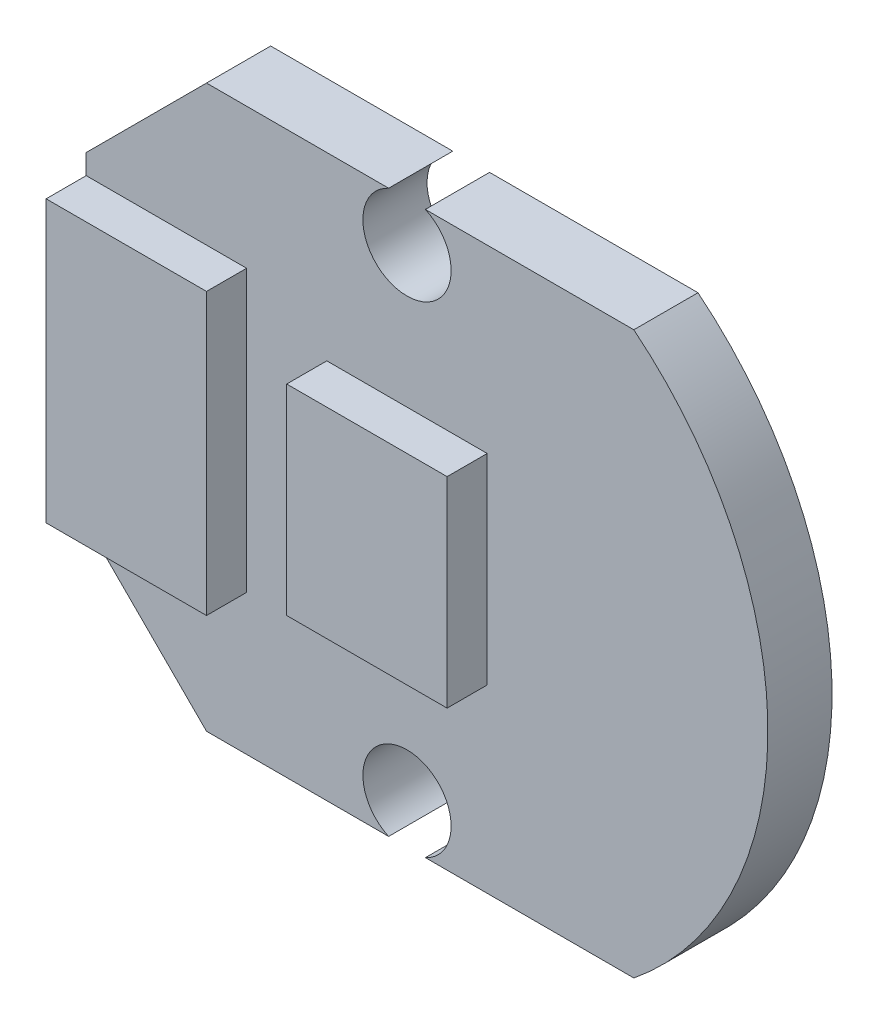
ISO-10303-21;
HEADER;
FILE_DESCRIPTION(('STEP AP214'),'2;1');
FILE_NAME('part.step','',(''),(''),'','','');
FILE_SCHEMA(('AUTOMOTIVE_DESIGN { 1 0 10303 214 1 1 1 1 }'));
ENDSEC;
DATA;
#1=APPLICATION_CONTEXT('core data for automotive mechanical design processes');
#2=APPLICATION_PROTOCOL_DEFINITION('international standard','automotive_design',2000,#1);
#3=PRODUCT_CONTEXT('',#1,'mechanical');
#4=PRODUCT('Part','Part','',(#3));
#5=PRODUCT_RELATED_PRODUCT_CATEGORY('part','',(#4));
#6=PRODUCT_DEFINITION_FORMATION('','',#4);
#7=PRODUCT_DEFINITION_CONTEXT('part definition',#1,'design');
#8=PRODUCT_DEFINITION('design','',#6,#7);
#9=PRODUCT_DEFINITION_SHAPE('','',#8);
#10=(LENGTH_UNIT() NAMED_UNIT(*) SI_UNIT(.MILLI.,.METRE.));
#11=(NAMED_UNIT(*) PLANE_ANGLE_UNIT() SI_UNIT($,.RADIAN.));
#12=(NAMED_UNIT(*) SI_UNIT($,.STERADIAN.) SOLID_ANGLE_UNIT());
#13=UNCERTAINTY_MEASURE_WITH_UNIT(LENGTH_MEASURE(1.E-05),#10,'distance_accuracy_value','');
#14=(GEOMETRIC_REPRESENTATION_CONTEXT(3) GLOBAL_UNCERTAINTY_ASSIGNED_CONTEXT((#13)) GLOBAL_UNIT_ASSIGNED_CONTEXT((#10,
#11,#12)) REPRESENTATION_CONTEXT('',''));
#15=CARTESIAN_POINT('',(0.,0.,0.));
#16=DIRECTION('',(0.,0.,1.));
#17=DIRECTION('',(1.,0.,0.));
#18=AXIS2_PLACEMENT_3D('',#15,#16,#17);
#19=CARTESIAN_POINT('',(0.,0.,1.6));
#20=DIRECTION('',(0.,0.,-1.));
#21=DIRECTION('',(-1.,0.,0.));
#22=AXIS2_PLACEMENT_3D('',#19,#20,#21);
#23=PLANE('',#22);
#24=DIRECTION('',(0.,1.,0.));
#25=VECTOR('',#24,1.);
#26=CARTESIAN_POINT('',(2.,2.5,1.6));
#27=LINE('',#26,#25);
#28=CARTESIAN_POINT('',(2.,-2.5,1.6));
#29=VERTEX_POINT('',#28);
#30=CARTESIAN_POINT('',(2.,2.5,1.6));
#31=VERTEX_POINT('',#30);
#32=EDGE_CURVE('E180',#29,#31,#27,.T.);
#33=ORIENTED_EDGE('',*,*,#32,.F.);
#34=DIRECTION('',(1.,0.,0.));
#35=VECTOR('',#34,1.);
#36=CARTESIAN_POINT('',(-2.,-2.5,1.6));
#37=LINE('',#36,#35);
#38=CARTESIAN_POINT('',(-2.,-2.5,1.6));
#39=VERTEX_POINT('',#38);
#40=EDGE_CURVE('E193',#39,#29,#37,.T.);
#41=ORIENTED_EDGE('',*,*,#40,.F.);
#42=DIRECTION('',(0.,-1.,0.));
#43=VECTOR('',#42,1.);
#44=CARTESIAN_POINT('',(-2.,2.5,1.6));
#45=LINE('',#44,#43);
#46=CARTESIAN_POINT('',(-2.,2.5,1.6));
#47=VERTEX_POINT('',#46);
#48=EDGE_CURVE('E202',#47,#39,#45,.T.);
#49=ORIENTED_EDGE('',*,*,#48,.F.);
#50=DIRECTION('',(-1.,0.,0.));
#51=VECTOR('',#50,1.);
#52=CARTESIAN_POINT('',(-2.,2.5,1.6));
#53=LINE('',#52,#51);
#54=EDGE_CURVE('E183',#31,#47,#53,.T.);
#55=ORIENTED_EDGE('',*,*,#54,.F.);
#56=EDGE_LOOP('',(#33,#41,#49,#55));
#57=FACE_BOUND('',#56,.T.);
#58=DIRECTION('',(1.,0.,0.));
#59=VECTOR('',#58,1.);
#60=CARTESIAN_POINT('',(-4.,-3.5,1.6));
#61=LINE('',#60,#59);
#62=CARTESIAN_POINT('',(-8.,-3.5,1.6));
#63=VERTEX_POINT('',#62);
#64=CARTESIAN_POINT('',(-4.,-3.5,1.6));
#65=VERTEX_POINT('',#64);
#66=EDGE_CURVE('E335',#63,#65,#61,.T.);
#67=ORIENTED_EDGE('',*,*,#66,.F.);
#68=DIRECTION('',(0.,-1.,0.));
#69=VECTOR('',#68,1.);
#70=CARTESIAN_POINT('',(-8.,3.99999999999999,1.6));
#71=LINE('',#70,#69);
#72=CARTESIAN_POINT('',(-8.,-3.99999999999999,1.6));
#73=VERTEX_POINT('',#72);
#74=EDGE_CURVE('E179',#63,#73,#71,.T.);
#75=ORIENTED_EDGE('',*,*,#74,.T.);
#76=DIRECTION('',(0.707106781186546,-0.707106781186549,0.));
#77=VECTOR('',#76,1.);
#78=CARTESIAN_POINT('',(-8.,-3.99999999999999,1.6));
#79=LINE('',#78,#77);
#80=CARTESIAN_POINT('',(-5.,-7.,1.6));
#81=VERTEX_POINT('',#80);
#82=EDGE_CURVE('E247',#73,#81,#79,.T.);
#83=ORIENTED_EDGE('',*,*,#82,.T.);
#84=DIRECTION('',(1.,0.,0.));
#85=VECTOR('',#84,1.);
#86=CARTESIAN_POINT('',(-5.,-7.,1.6));
#87=LINE('',#86,#85);
#88=CARTESIAN_POINT('',(-0.458257569496079,-7.,1.6));
#89=VERTEX_POINT('',#88);
#90=EDGE_CURVE('E250',#81,#89,#87,.T.);
#91=ORIENTED_EDGE('',*,*,#90,.T.);
#92=CARTESIAN_POINT('',(0.,-6.00000000000023,1.6));
#93=DIRECTION('',(0.,0.,1.));
#94=DIRECTION('',(-1.,0.,0.));
#95=AXIS2_PLACEMENT_3D('',#92,#93,#94);
#96=CIRCLE('',#95,1.1);
#97=CARTESIAN_POINT('',(0.458257569496079,-7.,1.6));
#98=VERTEX_POINT('',#97);
#99=EDGE_CURVE('E218',#98,#89,#96,.T.);
#100=ORIENTED_EDGE('',*,*,#99,.F.);
#101=CARTESIAN_POINT('',(5.65685424949238,-7.,1.6));
#102=VERTEX_POINT('',#101);
#103=EDGE_CURVE('E249',#98,#102,#87,.T.);
#104=ORIENTED_EDGE('',*,*,#103,.T.);
#105=CARTESIAN_POINT('',(0.,0.,1.6));
#106=DIRECTION('',(0.,0.,1.));
#107=DIRECTION('',(-1.,0.,0.));
#108=AXIS2_PLACEMENT_3D('',#105,#106,#107);
#109=CIRCLE('',#108,9.);
#110=CARTESIAN_POINT('',(5.65685424949238,7.,1.6));
#111=VERTEX_POINT('',#110);
#112=EDGE_CURVE('E235',#102,#111,#109,.T.);
#113=ORIENTED_EDGE('',*,*,#112,.T.);
#114=DIRECTION('',(-1.,0.,0.));
#115=VECTOR('',#114,1.);
#116=CARTESIAN_POINT('',(5.65685424949238,7.,1.6));
#117=LINE('',#116,#115);
#118=CARTESIAN_POINT('',(0.458257569496079,7.,1.6));
#119=VERTEX_POINT('',#118);
#120=EDGE_CURVE('E240',#111,#119,#117,.T.);
#121=ORIENTED_EDGE('',*,*,#120,.T.);
#122=CARTESIAN_POINT('',(0.,6.00000000000023,1.6));
#123=DIRECTION('',(0.,0.,1.));
#124=DIRECTION('',(1.,0.,0.));
#125=AXIS2_PLACEMENT_3D('',#122,#123,#124);
#126=CIRCLE('',#125,1.1);
#127=CARTESIAN_POINT('',(-0.458257569496079,7.,1.6));
#128=VERTEX_POINT('',#127);
#129=EDGE_CURVE('E219',#128,#119,#126,.T.);
#130=ORIENTED_EDGE('',*,*,#129,.F.);
#131=CARTESIAN_POINT('',(-5.,7.,1.6));
#132=VERTEX_POINT('',#131);
#133=EDGE_CURVE('E238',#128,#132,#117,.T.);
#134=ORIENTED_EDGE('',*,*,#133,.T.);
#135=DIRECTION('',(-0.707106781186546,-0.707106781186549,0.));
#136=VECTOR('',#135,1.);
#137=CARTESIAN_POINT('',(-5.,7.,1.6));
#138=LINE('',#137,#136);
#139=CARTESIAN_POINT('',(-8.,3.99999999999999,1.6));
#140=VERTEX_POINT('',#139);
#141=EDGE_CURVE('E243',#132,#140,#138,.T.);
#142=ORIENTED_EDGE('',*,*,#141,.T.);
#143=CARTESIAN_POINT('',(-8.,3.5,1.6));
#144=VERTEX_POINT('',#143);
#145=EDGE_CURVE('E245',#140,#144,#71,.T.);
#146=ORIENTED_EDGE('',*,*,#145,.T.);
#147=DIRECTION('',(-1.,0.,0.));
#148=VECTOR('',#147,1.);
#149=CARTESIAN_POINT('',(-4.,3.5,1.6));
#150=LINE('',#149,#148);
#151=CARTESIAN_POINT('',(-4.,3.5,1.6));
#152=VERTEX_POINT('',#151);
#153=EDGE_CURVE('E54',#152,#144,#150,.T.);
#154=ORIENTED_EDGE('',*,*,#153,.F.);
#155=DIRECTION('',(0.,1.,0.));
#156=VECTOR('',#155,1.);
#157=CARTESIAN_POINT('',(-4.,-3.5,1.6));
#158=LINE('',#157,#156);
#159=EDGE_CURVE('E49',#65,#152,#158,.T.);
#160=ORIENTED_EDGE('',*,*,#159,.F.);
#161=EDGE_LOOP('',(#67,#75,#83,#91,#100,#104,#113,#121,#130,#134,#142,#146,#154,#160));
#162=FACE_BOUND('',#161,.T.);
#163=ADVANCED_FACE('F34',(#57,#162),#23,.F.);
#164=CARTESIAN_POINT('',(5.65685424949238,7.,1.6));
#165=DIRECTION('',(0.,-1.,0.));
#166=DIRECTION('',(1.,0.,0.));
#167=AXIS2_PLACEMENT_3D('',#164,#165,#166);
#168=PLANE('',#167);
#169=DIRECTION('',(-1.,0.,0.));
#170=VECTOR('',#169,1.);
#171=CARTESIAN_POINT('',(5.65685424949238,7.,0.));
#172=LINE('',#171,#170);
#173=CARTESIAN_POINT('',(5.65685424949238,7.,0.));
#174=VERTEX_POINT('',#173);
#175=CARTESIAN_POINT('',(0.458257569496079,7.,0.));
#176=VERTEX_POINT('',#175);
#177=EDGE_CURVE('E257',#174,#176,#172,.T.);
#178=ORIENTED_EDGE('',*,*,#177,.T.);
#179=DIRECTION('',(0.,0.,1.));
#180=VECTOR('',#179,1.);
#181=CARTESIAN_POINT('',(0.458257569496079,7.,0.));
#182=LINE('',#181,#180);
#183=EDGE_CURVE('E231',#176,#119,#182,.T.);
#184=ORIENTED_EDGE('',*,*,#183,.T.);
#185=ORIENTED_EDGE('',*,*,#120,.F.);
#186=DIRECTION('',(0.,0.,-1.));
#187=VECTOR('',#186,1.);
#188=CARTESIAN_POINT('',(5.65685424949238,7.,1.6));
#189=LINE('',#188,#187);
#190=EDGE_CURVE('E283',#111,#174,#189,.T.);
#191=ORIENTED_EDGE('',*,*,#190,.T.);
#192=EDGE_LOOP('',(#178,#184,#185,#191));
#193=FACE_BOUND('',#192,.T.);
#194=ADVANCED_FACE('F349',(#193),#168,.F.);
#195=CARTESIAN_POINT('',(-5.,-7.,1.6));
#196=DIRECTION('',(0.,1.,0.));
#197=DIRECTION('',(0.,0.,1.));
#198=AXIS2_PLACEMENT_3D('',#195,#196,#197);
#199=PLANE('',#198);
#200=DIRECTION('',(1.,0.,0.));
#201=VECTOR('',#200,1.);
#202=CARTESIAN_POINT('',(-5.,-7.,0.));
#203=LINE('',#202,#201);
#204=CARTESIAN_POINT('',(-5.,-7.,0.));
#205=VERTEX_POINT('',#204);
#206=CARTESIAN_POINT('',(-0.458257569496079,-7.,0.));
#207=VERTEX_POINT('',#206);
#208=EDGE_CURVE('E239',#205,#207,#203,.T.);
#209=ORIENTED_EDGE('',*,*,#208,.T.);
#210=DIRECTION('',(0.,0.,1.));
#211=VECTOR('',#210,1.);
#212=CARTESIAN_POINT('',(-0.458257569496079,-7.,0.));
#213=LINE('',#212,#211);
#214=EDGE_CURVE('E225',#207,#89,#213,.T.);
#215=ORIENTED_EDGE('',*,*,#214,.T.);
#216=ORIENTED_EDGE('',*,*,#90,.F.);
#217=DIRECTION('',(0.,0.,-1.));
#218=VECTOR('',#217,1.);
#219=CARTESIAN_POINT('',(-5.,-7.,1.6));
#220=LINE('',#219,#218);
#221=EDGE_CURVE('E271',#81,#205,#220,.T.);
#222=ORIENTED_EDGE('',*,*,#221,.T.);
#223=EDGE_LOOP('',(#209,#215,#216,#222));
#224=FACE_BOUND('',#223,.T.);
#225=ADVANCED_FACE('F305',(#224),#199,.F.);
#226=CARTESIAN_POINT('',(0.,0.,1.6));
#227=DIRECTION('',(0.,0.,-1.));
#228=DIRECTION('',(-1.,0.,0.));
#229=AXIS2_PLACEMENT_3D('',#226,#227,#228);
#230=CYLINDRICAL_SURFACE('',#229,9.);
#231=CARTESIAN_POINT('',(0.,0.,0.));
#232=DIRECTION('',(0.,0.,1.));
#233=DIRECTION('',(-1.,0.,0.));
#234=AXIS2_PLACEMENT_3D('',#231,#232,#233);
#235=CIRCLE('',#234,9.);
#236=CARTESIAN_POINT('',(5.65685424949238,-7.,0.));
#237=VERTEX_POINT('',#236);
#238=EDGE_CURVE('E234',#237,#174,#235,.T.);
#239=ORIENTED_EDGE('',*,*,#238,.T.);
#240=ORIENTED_EDGE('',*,*,#190,.F.);
#241=ORIENTED_EDGE('',*,*,#112,.F.);
#242=DIRECTION('',(0.,0.,-1.));
#243=VECTOR('',#242,1.);
#244=CARTESIAN_POINT('',(5.65685424949238,-7.,1.6));
#245=LINE('',#244,#243);
#246=EDGE_CURVE('E253',#102,#237,#245,.T.);
#247=ORIENTED_EDGE('',*,*,#246,.T.);
#248=EDGE_LOOP('',(#239,#240,#241,#247));
#249=FACE_BOUND('',#248,.T.);
#250=ADVANCED_FACE('F36',(#249),#230,.T.);
#251=ORIENTED_EDGE('',*,*,#133,.F.);
#252=DIRECTION('',(0.,0.,1.));
#253=VECTOR('',#252,1.);
#254=CARTESIAN_POINT('',(-0.458257569496079,7.,0.));
#255=LINE('',#254,#253);
#256=CARTESIAN_POINT('',(-0.458257569496079,7.,0.));
#257=VERTEX_POINT('',#256);
#258=EDGE_CURVE('E228',#128,#257,#255,.F.);
#259=ORIENTED_EDGE('',*,*,#258,.T.);
#260=CARTESIAN_POINT('',(-5.,7.,0.));
#261=VERTEX_POINT('',#260);
#262=EDGE_CURVE('E256',#257,#261,#172,.T.);
#263=ORIENTED_EDGE('',*,*,#262,.T.);
#264=DIRECTION('',(0.,0.,-1.));
#265=VECTOR('',#264,1.);
#266=CARTESIAN_POINT('',(-5.,7.,1.6));
#267=LINE('',#266,#265);
#268=EDGE_CURVE('E280',#132,#261,#267,.T.);
#269=ORIENTED_EDGE('',*,*,#268,.F.);
#270=EDGE_LOOP('',(#251,#259,#263,#269));
#271=FACE_BOUND('',#270,.T.);
#272=ADVANCED_FACE('F322',(#271),#168,.F.);
#273=CARTESIAN_POINT('',(-5.,7.,1.6));
#274=DIRECTION('',(0.707106781186549,-0.707106781186546,0.));
#275=DIRECTION('',(0.707106781186546,0.707106781186549,0.));
#276=AXIS2_PLACEMENT_3D('',#273,#274,#275);
#277=PLANE('',#276);
#278=DIRECTION('',(-0.707106781186546,-0.707106781186549,0.));
#279=VECTOR('',#278,1.);
#280=CARTESIAN_POINT('',(-5.,7.,0.));
#281=LINE('',#280,#279);
#282=CARTESIAN_POINT('',(-8.,3.99999999999999,0.));
#283=VERTEX_POINT('',#282);
#284=EDGE_CURVE('E260',#261,#283,#281,.T.);
#285=ORIENTED_EDGE('',*,*,#284,.T.);
#286=DIRECTION('',(0.,0.,-1.));
#287=VECTOR('',#286,1.);
#288=CARTESIAN_POINT('',(-8.,3.99999999999999,1.6));
#289=LINE('',#288,#287);
#290=EDGE_CURVE('E277',#140,#283,#289,.T.);
#291=ORIENTED_EDGE('',*,*,#290,.F.);
#292=ORIENTED_EDGE('',*,*,#141,.F.);
#293=ORIENTED_EDGE('',*,*,#268,.T.);
#294=EDGE_LOOP('',(#285,#291,#292,#293));
#295=FACE_BOUND('',#294,.T.);
#296=ADVANCED_FACE('F317',(#295),#277,.F.);
#297=CARTESIAN_POINT('',(-8.,3.99999999999999,1.6));
#298=DIRECTION('',(1.,0.,0.));
#299=DIRECTION('',(0.,0.,-1.));
#300=AXIS2_PLACEMENT_3D('',#297,#298,#299);
#301=PLANE('',#300);
#302=DIRECTION('',(0.,-1.,0.));
#303=VECTOR('',#302,1.);
#304=CARTESIAN_POINT('',(-8.,3.99999999999999,0.));
#305=LINE('',#304,#303);
#306=CARTESIAN_POINT('',(-8.,-3.99999999999999,0.));
#307=VERTEX_POINT('',#306);
#308=EDGE_CURVE('E262',#283,#307,#305,.T.);
#309=ORIENTED_EDGE('',*,*,#308,.T.);
#310=DIRECTION('',(0.,0.,-1.));
#311=VECTOR('',#310,1.);
#312=CARTESIAN_POINT('',(-8.,-3.99999999999999,1.6));
#313=LINE('',#312,#311);
#314=EDGE_CURVE('E274',#73,#307,#313,.T.);
#315=ORIENTED_EDGE('',*,*,#314,.F.);
#316=ORIENTED_EDGE('',*,*,#74,.F.);
#317=DIRECTION('',(0.,0.,-1.));
#318=VECTOR('',#317,1.);
#319=CARTESIAN_POINT('',(-8.,-3.5,2.6));
#320=LINE('',#319,#318);
#321=CARTESIAN_POINT('',(-8.,-3.5,2.6));
#322=VERTEX_POINT('',#321);
#323=EDGE_CURVE('E161',#322,#63,#320,.T.);
#324=ORIENTED_EDGE('',*,*,#323,.F.);
#325=DIRECTION('',(0.,-1.,0.));
#326=VECTOR('',#325,1.);
#327=CARTESIAN_POINT('',(-8.,-3.5,2.6));
#328=LINE('',#327,#326);
#329=CARTESIAN_POINT('',(-8.,3.5,2.6));
#330=VERTEX_POINT('',#329);
#331=EDGE_CURVE('E167',#330,#322,#328,.T.);
#332=ORIENTED_EDGE('',*,*,#331,.F.);
#333=DIRECTION('',(0.,0.,-1.));
#334=VECTOR('',#333,1.);
#335=CARTESIAN_POINT('',(-8.,3.5,2.6));
#336=LINE('',#335,#334);
#337=EDGE_CURVE('E328',#330,#144,#336,.T.);
#338=ORIENTED_EDGE('',*,*,#337,.T.);
#339=ORIENTED_EDGE('',*,*,#145,.F.);
#340=ORIENTED_EDGE('',*,*,#290,.T.);
#341=EDGE_LOOP('',(#309,#315,#316,#324,#332,#338,#339,#340));
#342=FACE_BOUND('',#341,.T.);
#343=ADVANCED_FACE('F177',(#342),#301,.F.);
#344=CARTESIAN_POINT('',(-8.,-3.99999999999999,1.6));
#345=DIRECTION('',(0.707106781186549,0.707106781186546,0.));
#346=DIRECTION('',(-0.707106781186546,0.707106781186549,0.));
#347=AXIS2_PLACEMENT_3D('',#344,#345,#346);
#348=PLANE('',#347);
#349=DIRECTION('',(0.707106781186546,-0.707106781186549,0.));
#350=VECTOR('',#349,1.);
#351=CARTESIAN_POINT('',(-8.,-3.99999999999999,0.));
#352=LINE('',#351,#350);
#353=EDGE_CURVE('E264',#307,#205,#352,.T.);
#354=ORIENTED_EDGE('',*,*,#353,.T.);
#355=ORIENTED_EDGE('',*,*,#221,.F.);
#356=ORIENTED_EDGE('',*,*,#82,.F.);
#357=ORIENTED_EDGE('',*,*,#314,.T.);
#358=EDGE_LOOP('',(#354,#355,#356,#357));
#359=FACE_BOUND('',#358,.T.);
#360=ADVANCED_FACE('F311',(#359),#348,.F.);
#361=ORIENTED_EDGE('',*,*,#103,.F.);
#362=DIRECTION('',(0.,0.,1.));
#363=VECTOR('',#362,1.);
#364=CARTESIAN_POINT('',(0.458257569496079,-7.,0.));
#365=LINE('',#364,#363);
#366=CARTESIAN_POINT('',(0.458257569496079,-7.,0.));
#367=VERTEX_POINT('',#366);
#368=EDGE_CURVE('E221',#98,#367,#365,.F.);
#369=ORIENTED_EDGE('',*,*,#368,.T.);
#370=EDGE_CURVE('E266',#367,#237,#203,.T.);
#371=ORIENTED_EDGE('',*,*,#370,.T.);
#372=ORIENTED_EDGE('',*,*,#246,.F.);
#373=EDGE_LOOP('',(#361,#369,#371,#372));
#374=FACE_BOUND('',#373,.T.);
#375=ADVANCED_FACE('F294',(#374),#199,.F.);
#376=CARTESIAN_POINT('',(0.,0.,0.));
#377=DIRECTION('',(0.,0.,-1.));
#378=DIRECTION('',(-1.,0.,0.));
#379=AXIS2_PLACEMENT_3D('',#376,#377,#378);
#380=PLANE('',#379);
#381=CARTESIAN_POINT('',(0.,6.00000000000023,0.));
#382=DIRECTION('',(0.,0.,-1.));
#383=DIRECTION('',(-1.,0.,0.));
#384=AXIS2_PLACEMENT_3D('',#381,#382,#383);
#385=CIRCLE('',#384,1.1);
#386=EDGE_CURVE('E11',#176,#257,#385,.T.);
#387=ORIENTED_EDGE('',*,*,#386,.F.);
#388=ORIENTED_EDGE('',*,*,#177,.F.);
#389=ORIENTED_EDGE('',*,*,#238,.F.);
#390=ORIENTED_EDGE('',*,*,#370,.F.);
#391=CARTESIAN_POINT('',(0.,-6.00000000000023,0.));
#392=DIRECTION('',(0.,0.,-1.));
#393=DIRECTION('',(-1.,0.,0.));
#394=AXIS2_PLACEMENT_3D('',#391,#392,#393);
#395=CIRCLE('',#394,1.1);
#396=EDGE_CURVE('E42',#207,#367,#395,.T.);
#397=ORIENTED_EDGE('',*,*,#396,.F.);
#398=ORIENTED_EDGE('',*,*,#208,.F.);
#399=ORIENTED_EDGE('',*,*,#353,.F.);
#400=ORIENTED_EDGE('',*,*,#308,.F.);
#401=ORIENTED_EDGE('',*,*,#284,.F.);
#402=ORIENTED_EDGE('',*,*,#262,.F.);
#403=EDGE_LOOP('',(#387,#388,#389,#390,#397,#398,#399,#400,#401,#402));
#404=FACE_BOUND('',#403,.T.);
#405=ADVANCED_FACE('F298',(#404),#380,.T.);
#406=CARTESIAN_POINT('',(0.,-6.00000000000023,0.));
#407=DIRECTION('',(0.,0.,1.));
#408=DIRECTION('',(1.,0.,0.));
#409=AXIS2_PLACEMENT_3D('',#406,#407,#408);
#410=CYLINDRICAL_SURFACE('',#409,1.1);
#411=ORIENTED_EDGE('',*,*,#396,.T.);
#412=ORIENTED_EDGE('',*,*,#368,.F.);
#413=ORIENTED_EDGE('',*,*,#99,.T.);
#414=ORIENTED_EDGE('',*,*,#214,.F.);
#415=EDGE_LOOP('',(#411,#412,#413,#414));
#416=FACE_BOUND('',#415,.T.);
#417=ADVANCED_FACE('F287',(#416),#410,.F.);
#418=CARTESIAN_POINT('',(0.,6.00000000000023,0.));
#419=DIRECTION('',(0.,0.,1.));
#420=DIRECTION('',(1.,0.,0.));
#421=AXIS2_PLACEMENT_3D('',#418,#419,#420);
#422=CYLINDRICAL_SURFACE('',#421,1.1);
#423=ORIENTED_EDGE('',*,*,#386,.T.);
#424=ORIENTED_EDGE('',*,*,#258,.F.);
#425=ORIENTED_EDGE('',*,*,#129,.T.);
#426=ORIENTED_EDGE('',*,*,#183,.F.);
#427=EDGE_LOOP('',(#423,#424,#425,#426));
#428=FACE_BOUND('',#427,.T.);
#429=ADVANCED_FACE('F324',(#428),#422,.F.);
#430=CARTESIAN_POINT('',(2.,2.5,2.6));
#431=DIRECTION('',(-1.,0.,0.));
#432=DIRECTION('',(0.,-1.,0.));
#433=AXIS2_PLACEMENT_3D('',#430,#431,#432);
#434=PLANE('',#433);
#435=ORIENTED_EDGE('',*,*,#32,.T.);
#436=DIRECTION('',(0.,0.,-1.));
#437=VECTOR('',#436,1.);
#438=CARTESIAN_POINT('',(2.,2.5,2.6));
#439=LINE('',#438,#437);
#440=CARTESIAN_POINT('',(2.,2.5,2.6));
#441=VERTEX_POINT('',#440);
#442=EDGE_CURVE('E215',#441,#31,#439,.T.);
#443=ORIENTED_EDGE('',*,*,#442,.F.);
#444=DIRECTION('',(0.,1.,0.));
#445=VECTOR('',#444,1.);
#446=CARTESIAN_POINT('',(2.,2.5,2.6));
#447=LINE('',#446,#445);
#448=CARTESIAN_POINT('',(2.,-2.5,2.6));
#449=VERTEX_POINT('',#448);
#450=EDGE_CURVE('E189',#449,#441,#447,.T.);
#451=ORIENTED_EDGE('',*,*,#450,.F.);
#452=DIRECTION('',(0.,0.,-1.));
#453=VECTOR('',#452,1.);
#454=CARTESIAN_POINT('',(2.,-2.5,2.6));
#455=LINE('',#454,#453);
#456=EDGE_CURVE('E198',#449,#29,#455,.T.);
#457=ORIENTED_EDGE('',*,*,#456,.T.);
#458=EDGE_LOOP('',(#435,#443,#451,#457));
#459=FACE_BOUND('',#458,.T.);
#460=ADVANCED_FACE('F393',(#459),#434,.F.);
#461=CARTESIAN_POINT('',(-2.,2.5,2.6));
#462=DIRECTION('',(0.,-1.,0.));
#463=DIRECTION('',(0.,0.,-1.));
#464=AXIS2_PLACEMENT_3D('',#461,#462,#463);
#465=PLANE('',#464);
#466=ORIENTED_EDGE('',*,*,#54,.T.);
#467=DIRECTION('',(0.,0.,-1.));
#468=VECTOR('',#467,1.);
#469=CARTESIAN_POINT('',(-2.,2.5,2.6));
#470=LINE('',#469,#468);
#471=CARTESIAN_POINT('',(-2.,2.5,2.6));
#472=VERTEX_POINT('',#471);
#473=EDGE_CURVE('E212',#472,#47,#470,.T.);
#474=ORIENTED_EDGE('',*,*,#473,.F.);
#475=DIRECTION('',(-1.,0.,0.));
#476=VECTOR('',#475,1.);
#477=CARTESIAN_POINT('',(-2.,2.5,2.6));
#478=LINE('',#477,#476);
#479=EDGE_CURVE('E192',#441,#472,#478,.T.);
#480=ORIENTED_EDGE('',*,*,#479,.F.);
#481=ORIENTED_EDGE('',*,*,#442,.T.);
#482=EDGE_LOOP('',(#466,#474,#480,#481));
#483=FACE_BOUND('',#482,.T.);
#484=ADVANCED_FACE('F411',(#483),#465,.F.);
#485=CARTESIAN_POINT('',(-2.,2.5,2.6));
#486=DIRECTION('',(1.,0.,0.));
#487=DIRECTION('',(0.,1.,0.));
#488=AXIS2_PLACEMENT_3D('',#485,#486,#487);
#489=PLANE('',#488);
#490=ORIENTED_EDGE('',*,*,#48,.T.);
#491=DIRECTION('',(0.,0.,-1.));
#492=VECTOR('',#491,1.);
#493=CARTESIAN_POINT('',(-2.,-2.5,2.6));
#494=LINE('',#493,#492);
#495=CARTESIAN_POINT('',(-2.,-2.5,2.6));
#496=VERTEX_POINT('',#495);
#497=EDGE_CURVE('E209',#496,#39,#494,.T.);
#498=ORIENTED_EDGE('',*,*,#497,.F.);
#499=DIRECTION('',(0.,-1.,0.));
#500=VECTOR('',#499,1.);
#501=CARTESIAN_POINT('',(-2.,2.5,2.6));
#502=LINE('',#501,#500);
#503=EDGE_CURVE('E195',#472,#496,#502,.T.);
#504=ORIENTED_EDGE('',*,*,#503,.F.);
#505=ORIENTED_EDGE('',*,*,#473,.T.);
#506=EDGE_LOOP('',(#490,#498,#504,#505));
#507=FACE_BOUND('',#506,.T.);
#508=ADVANCED_FACE('F419',(#507),#489,.F.);
#509=CARTESIAN_POINT('',(-2.,-2.5,2.6));
#510=DIRECTION('',(0.,1.,0.));
#511=DIRECTION('',(0.,0.,1.));
#512=AXIS2_PLACEMENT_3D('',#509,#510,#511);
#513=PLANE('',#512);
#514=ORIENTED_EDGE('',*,*,#40,.T.);
#515=ORIENTED_EDGE('',*,*,#456,.F.);
#516=DIRECTION('',(1.,0.,0.));
#517=VECTOR('',#516,1.);
#518=CARTESIAN_POINT('',(-2.,-2.5,2.6));
#519=LINE('',#518,#517);
#520=EDGE_CURVE('E197',#496,#449,#519,.T.);
#521=ORIENTED_EDGE('',*,*,#520,.F.);
#522=ORIENTED_EDGE('',*,*,#497,.T.);
#523=EDGE_LOOP('',(#514,#515,#521,#522));
#524=FACE_BOUND('',#523,.T.);
#525=ADVANCED_FACE('F427',(#524),#513,.F.);
#526=CARTESIAN_POINT('',(0.,0.,2.6));
#527=DIRECTION('',(0.,0.,1.));
#528=DIRECTION('',(1.,0.,0.));
#529=AXIS2_PLACEMENT_3D('',#526,#527,#528);
#530=PLANE('',#529);
#531=ORIENTED_EDGE('',*,*,#450,.T.);
#532=ORIENTED_EDGE('',*,*,#479,.T.);
#533=ORIENTED_EDGE('',*,*,#503,.T.);
#534=ORIENTED_EDGE('',*,*,#520,.T.);
#535=EDGE_LOOP('',(#531,#532,#533,#534));
#536=FACE_BOUND('',#535,.T.);
#537=ADVANCED_FACE('F346',(#536),#530,.T.);
#538=CARTESIAN_POINT('',(-4.,-3.5,2.6));
#539=DIRECTION('',(0.,1.,0.));
#540=DIRECTION('',(-1.,0.,0.));
#541=AXIS2_PLACEMENT_3D('',#538,#539,#540);
#542=PLANE('',#541);
#543=ORIENTED_EDGE('',*,*,#66,.T.);
#544=DIRECTION('',(0.,0.,-1.));
#545=VECTOR('',#544,1.);
#546=CARTESIAN_POINT('',(-4.,-3.5,2.6));
#547=LINE('',#546,#545);
#548=CARTESIAN_POINT('',(-4.,-3.5,2.6));
#549=VERTEX_POINT('',#548);
#550=EDGE_CURVE('E163',#549,#65,#547,.T.);
#551=ORIENTED_EDGE('',*,*,#550,.F.);
#552=DIRECTION('',(1.,0.,0.));
#553=VECTOR('',#552,1.);
#554=CARTESIAN_POINT('',(-4.,-3.5,2.6));
#555=LINE('',#554,#553);
#556=EDGE_CURVE('E157',#322,#549,#555,.T.);
#557=ORIENTED_EDGE('',*,*,#556,.F.);
#558=ORIENTED_EDGE('',*,*,#323,.T.);
#559=EDGE_LOOP('',(#543,#551,#557,#558));
#560=FACE_BOUND('',#559,.T.);
#561=ADVANCED_FACE('F159',(#560),#542,.F.);
#562=CARTESIAN_POINT('',(-4.,-3.5,2.6));
#563=DIRECTION('',(-1.,0.,0.));
#564=DIRECTION('',(0.,0.,1.));
#565=AXIS2_PLACEMENT_3D('',#562,#563,#564);
#566=PLANE('',#565);
#567=ORIENTED_EDGE('',*,*,#159,.T.);
#568=DIRECTION('',(0.,0.,-1.));
#569=VECTOR('',#568,1.);
#570=CARTESIAN_POINT('',(-4.,3.5,2.6));
#571=LINE('',#570,#569);
#572=CARTESIAN_POINT('',(-4.,3.5,2.6));
#573=VERTEX_POINT('',#572);
#574=EDGE_CURVE('E185',#573,#152,#571,.T.);
#575=ORIENTED_EDGE('',*,*,#574,.F.);
#576=DIRECTION('',(0.,1.,0.));
#577=VECTOR('',#576,1.);
#578=CARTESIAN_POINT('',(-4.,-3.5,2.6));
#579=LINE('',#578,#577);
#580=EDGE_CURVE('E166',#549,#573,#579,.T.);
#581=ORIENTED_EDGE('',*,*,#580,.F.);
#582=ORIENTED_EDGE('',*,*,#550,.T.);
#583=EDGE_LOOP('',(#567,#575,#581,#582));
#584=FACE_BOUND('',#583,.T.);
#585=ADVANCED_FACE('F338',(#584),#566,.F.);
#586=CARTESIAN_POINT('',(-4.,3.5,2.6));
#587=DIRECTION('',(0.,-1.,0.));
#588=DIRECTION('',(0.,0.,-1.));
#589=AXIS2_PLACEMENT_3D('',#586,#587,#588);
#590=PLANE('',#589);
#591=ORIENTED_EDGE('',*,*,#153,.T.);
#592=ORIENTED_EDGE('',*,*,#337,.F.);
#593=DIRECTION('',(-1.,0.,0.));
#594=VECTOR('',#593,1.);
#595=CARTESIAN_POINT('',(-4.,3.5,2.6));
#596=LINE('',#595,#594);
#597=EDGE_CURVE('E172',#573,#330,#596,.T.);
#598=ORIENTED_EDGE('',*,*,#597,.F.);
#599=ORIENTED_EDGE('',*,*,#574,.T.);
#600=EDGE_LOOP('',(#591,#592,#598,#599));
#601=FACE_BOUND('',#600,.T.);
#602=ADVANCED_FACE('F327',(#601),#590,.F.);
#603=CARTESIAN_POINT('',(0.,0.,2.6));
#604=DIRECTION('',(0.,0.,1.));
#605=DIRECTION('',(1.,0.,0.));
#606=AXIS2_PLACEMENT_3D('',#603,#604,#605);
#607=PLANE('',#606);
#608=ORIENTED_EDGE('',*,*,#331,.T.);
#609=ORIENTED_EDGE('',*,*,#556,.T.);
#610=ORIENTED_EDGE('',*,*,#580,.T.);
#611=ORIENTED_EDGE('',*,*,#597,.T.);
#612=EDGE_LOOP('',(#608,#609,#610,#611));
#613=FACE_BOUND('',#612,.T.);
#614=ADVANCED_FACE('F170',(#613),#607,.T.);
#615=CLOSED_SHELL('',(#163,#194,#225,#250,#272,#296,#343,#360,#375,#405,#417,#429,#460,#484,
#508,#525,#537,#561,#585,#602,#614));
#616=MANIFOLD_SOLID_BREP('B2',#615);
#617=ADVANCED_BREP_SHAPE_REPRESENTATION('',(#18,#616),#14);
#618=SHAPE_DEFINITION_REPRESENTATION(#9,#617);
ENDSEC;
END-ISO-10303-21;
